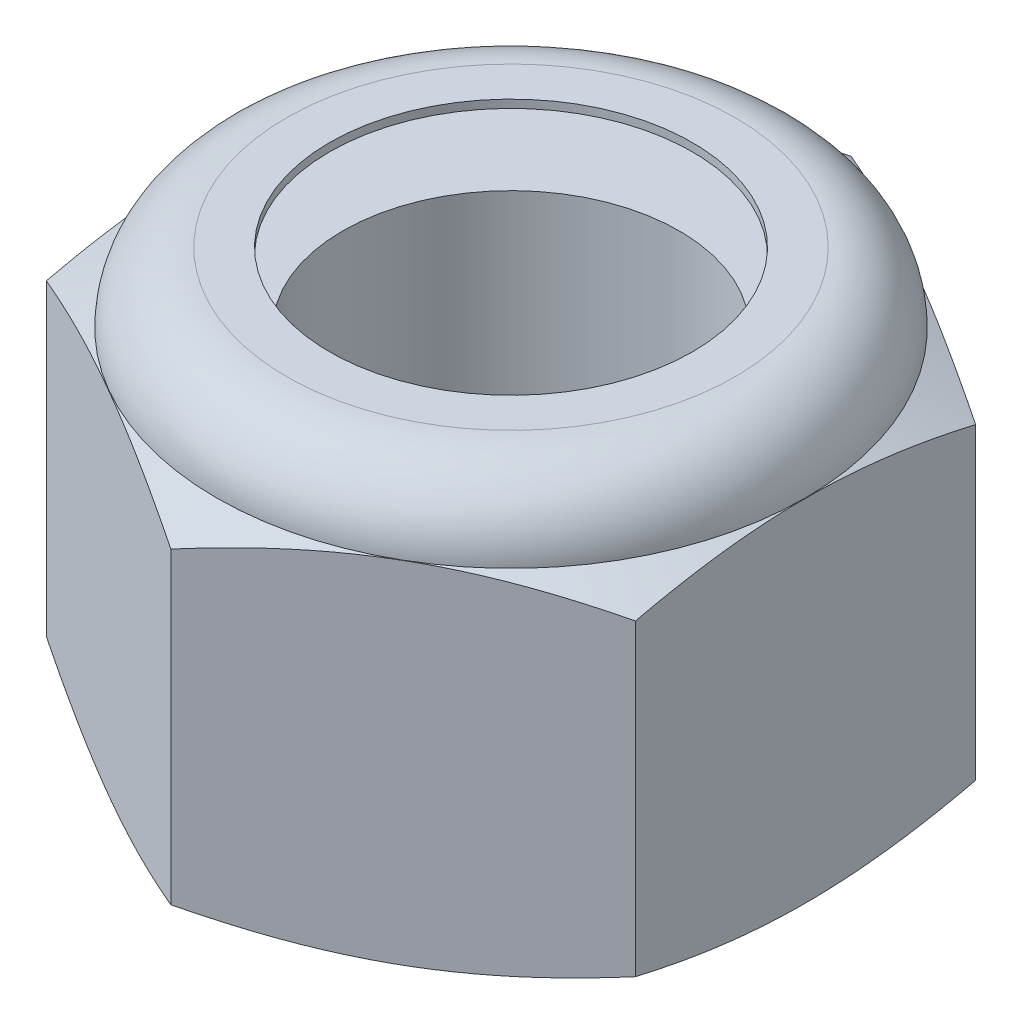
ISO-10303-21;
HEADER;
FILE_DESCRIPTION(('STEP AP214'),'2;1');
FILE_NAME('part.step','',(''),(''),'','','');
FILE_SCHEMA(('AUTOMOTIVE_DESIGN { 1 0 10303 214 1 1 1 1 }'));
ENDSEC;
DATA;
#1=APPLICATION_CONTEXT('core data for automotive mechanical design processes');
#2=APPLICATION_PROTOCOL_DEFINITION('international standard','automotive_design',2000,#1);
#3=PRODUCT_CONTEXT('',#1,'mechanical');
#4=PRODUCT('Part','Part','',(#3));
#5=PRODUCT_RELATED_PRODUCT_CATEGORY('part','',(#4));
#6=PRODUCT_DEFINITION_FORMATION('','',#4);
#7=PRODUCT_DEFINITION_CONTEXT('part definition',#1,'design');
#8=PRODUCT_DEFINITION('design','',#6,#7);
#9=PRODUCT_DEFINITION_SHAPE('','',#8);
#10=(LENGTH_UNIT() NAMED_UNIT(*) SI_UNIT(.MILLI.,.METRE.));
#11=(NAMED_UNIT(*) PLANE_ANGLE_UNIT() SI_UNIT($,.RADIAN.));
#12=(NAMED_UNIT(*) SI_UNIT($,.STERADIAN.) SOLID_ANGLE_UNIT());
#13=UNCERTAINTY_MEASURE_WITH_UNIT(LENGTH_MEASURE(1.E-05),#10,'distance_accuracy_value','');
#14=(GEOMETRIC_REPRESENTATION_CONTEXT(3) GLOBAL_UNCERTAINTY_ASSIGNED_CONTEXT((#13)) GLOBAL_UNIT_ASSIGNED_CONTEXT((#10,
#11,#12)) REPRESENTATION_CONTEXT('',''));
#15=CARTESIAN_POINT('',(0.,0.,0.));
#16=DIRECTION('',(0.,0.,1.));
#17=DIRECTION('',(1.,0.,0.));
#18=AXIS2_PLACEMENT_3D('',#15,#16,#17);
#19=CARTESIAN_POINT('',(2.77555756156289E-13,7.9375,-1.77635683940025E-12));
#20=DIRECTION('',(0.,1.,0.));
#21=DIRECTION('',(-1.,0.,0.));
#22=AXIS2_PLACEMENT_3D('',#19,#20,#21);
#23=PLANE('',#22);
#24=CARTESIAN_POINT('',(4.44337974886216E-13,7.93749999999992,0.));
#25=DIRECTION('',(0.,-1.,0.));
#26=DIRECTION('',(0.,0.,-1.));
#27=AXIS2_PLACEMENT_3D('',#24,#25,#26);
#28=CIRCLE('',#27,4.2314048663715);
#29=CARTESIAN_POINT('',(4.40013117424707E-13,7.93749999999992,-4.2314048663715));
#30=VERTEX_POINT('',#29);
#31=EDGE_CURVE('E264',#30,#30,#28,.T.);
#32=ORIENTED_EDGE('',*,*,#31,.F.);
#33=EDGE_LOOP('',(#32));
#34=FACE_BOUND('',#33,.T.);
#35=CARTESIAN_POINT('',(4.44337974886216E-13,7.9375,0.));
#36=DIRECTION('',(0.,-1.,0.));
#37=DIRECTION('',(1.,0.,0.));
#38=AXIS2_PLACEMENT_3D('',#35,#36,#37);
#39=CIRCLE('',#38,3.421620792);
#40=CARTESIAN_POINT('',(3.42162079200044,7.9375,0.));
#41=VERTEX_POINT('',#40);
#42=EDGE_CURVE('E273',#41,#41,#39,.T.);
#43=ORIENTED_EDGE('',*,*,#42,.T.);
#44=EDGE_LOOP('',(#43));
#45=FACE_BOUND('',#44,.T.);
#46=ADVANCED_FACE('F17',(#34,#45),#23,.T.);
#47=CARTESIAN_POINT('',(4.44089209850063E-13,6.61669999999992,0.));
#48=DIRECTION('',(0.,-1.,0.));
#49=DIRECTION('',(0.,0.,-1.));
#50=AXIS2_PLACEMENT_3D('',#47,#48,#49);
#51=TOROIDAL_SURFACE('',#50,4.23140486636972,1.3208);
#52=ORIENTED_EDGE('',*,*,#31,.T.);
#53=EDGE_LOOP('',(#52));
#54=FACE_BOUND('',#53,.T.);
#55=CARTESIAN_POINT('',(4.44089209850057E-13,6.61669999996661,0.));
#56=DIRECTION('',(0.,-1.,0.));
#57=DIRECTION('',(0.,0.,-1.));
#58=AXIS2_PLACEMENT_3D('',#55,#56,#57);
#59=CIRCLE('',#58,5.55220486637609);
#60=CARTESIAN_POINT('',(4.39774279873964E-13,6.61669999996661,-5.55220486637609));
#61=VERTEX_POINT('',#60);
#62=EDGE_CURVE('E275',#61,#61,#59,.T.);
#63=ORIENTED_EDGE('',*,*,#62,.F.);
#64=EDGE_LOOP('',(#63));
#65=FACE_BOUND('',#64,.T.);
#66=ADVANCED_FACE('F247',(#54,#65),#51,.T.);
#67=CARTESIAN_POINT('',(4.44089209850063E-13,6.61669999999992,0.));
#68=DIRECTION('',(0.,-1.,0.));
#69=DIRECTION('',(1.,0.,0.));
#70=AXIS2_PLACEMENT_3D('',#67,#68,#69);
#71=CYLINDRICAL_SURFACE('',#70,3.421620792);
#72=CARTESIAN_POINT('',(4.44309271228198E-13,7.7851,0.));
#73=DIRECTION('',(0.,-1.,0.));
#74=DIRECTION('',(1.,0.,0.));
#75=AXIS2_PLACEMENT_3D('',#72,#73,#74);
#76=CIRCLE('',#75,3.421620792);
#77=CARTESIAN_POINT('',(3.42162079200044,7.7851,0.));
#78=VERTEX_POINT('',#77);
#79=EDGE_CURVE('E81',#78,#78,#76,.T.);
#80=ORIENTED_EDGE('',*,*,#79,.T.);
#81=EDGE_LOOP('',(#80));
#82=FACE_BOUND('',#81,.T.);
#83=ORIENTED_EDGE('',*,*,#42,.F.);
#84=EDGE_LOOP('',(#83));
#85=FACE_BOUND('',#84,.T.);
#86=ADVANCED_FACE('F120',(#82,#85),#71,.F.);
#87=CARTESIAN_POINT('',(4.44012907934277E-13,6.21158048670623,0.));
#88=DIRECTION('',(0.,-1.,0.));
#89=DIRECTION('',(1.,0.,0.));
#90=AXIS2_PLACEMENT_3D('',#87,#88,#89);
#91=CONICAL_SURFACE('',#90,6.42098646619615,1.13446401379256);
#92=CARTESIAN_POINT('',(5.55625000000037,6.21399670638857,3.20790243317742));
#93=CARTESIAN_POINT('',(5.55625000000037,6.25923149858387,3.01388069204533));
#94=CARTESIAN_POINT('',(5.55625000000037,6.30156116960473,2.8191430562682));
#95=CARTESIAN_POINT('',(5.55625000000037,6.37940195851391,2.4282064821852));
#96=CARTESIAN_POINT('',(5.55625000000037,6.41490938776108,2.23200681260421));
#97=CARTESIAN_POINT('',(5.55625000000037,6.47807593658911,1.83814175454687));
#98=CARTESIAN_POINT('',(5.55625000000037,6.50572767728099,1.64047516580268));
#99=CARTESIAN_POINT('',(5.55625000000037,6.55216216918113,1.24412871221481));
#100=CARTESIAN_POINT('',(5.55625000000037,6.57094658201265,1.04544904426786));
#101=CARTESIAN_POINT('',(5.55625000000037,6.59860880741671,0.65153278954075));
#102=CARTESIAN_POINT('',(5.55625000000037,6.60768394067837,0.456310222188281));
#103=CARTESIAN_POINT('',(5.55625000000037,6.61623069714288,0.0656400290209491));
#104=CARTESIAN_POINT('',(5.55625000000037,6.61570174839892,-0.129807609504385));
#105=CARTESIAN_POINT('',(5.55625000000037,6.60506698548026,-0.520255424544184));
#106=CARTESIAN_POINT('',(5.55625000000037,6.59497009518901,-0.715255848303498));
#107=CARTESIAN_POINT('',(5.55625000000037,6.56563412978671,-1.10454411158436));
#108=CARTESIAN_POINT('',(5.55625000000037,6.5463958863742,-1.29883201431229));
#109=CARTESIAN_POINT('',(5.55625000000037,6.5055731461627,-1.63629474226344));
#110=CARTESIAN_POINT('',(5.55625000000037,6.48587969615706,-1.77970356548578));
#111=CARTESIAN_POINT('',(5.55625000000037,6.44224062386883,-2.06586571283912));
#112=CARTESIAN_POINT('',(5.55625000000038,6.41829517876256,-2.2086190640288));
#113=CARTESIAN_POINT('',(5.55625000000038,6.36633470846602,-2.49457300024797));
#114=CARTESIAN_POINT('',(5.55625000000038,6.33828827782006,-2.63776783527736));
#115=CARTESIAN_POINT('',(5.55625000000038,6.27867944477876,-2.92340048442409));
#116=CARTESIAN_POINT('',(5.55625000000038,6.24711763070223,-3.06583842104466));
#117=CARTESIAN_POINT('',(5.55625000000038,6.21399670638795,-3.2079024331801));
#118=B_SPLINE_CURVE_WITH_KNOTS('',3,(#92,#93,#94,#95,#96,#97,#98,#99,#100,#101,#102,#103,#104,
#105,#106,#107,#108,#109,#110,#111,#112,#113,#114,#115,#116,#117),.UNSPECIFIED.,.F.,.F.,(4,2,2,
2,2,2,2,2,2,2,2,2,4),(0.,0.597709107154746,1.19574047907784,1.79433174159176,2.39281079122883,
2.97888145915259,3.56498702914658,4.15054648426825,4.73605267422042,5.17025326679684,
5.60443577091931,6.04213667675271,6.47976444067784),.UNSPECIFIED.);
#119=CARTESIAN_POINT('',(5.55624999999998,6.21399670638805,3.20790243318035));
#120=VERTEX_POINT('',#119);
#121=CARTESIAN_POINT('',(5.55624999999768,6.21399670638777,-3.20790243318553));
#122=VERTEX_POINT('',#121);
#123=EDGE_CURVE('E69',#120,#122,#118,.T.);
#124=ORIENTED_EDGE('',*,*,#123,.T.);
#125=CARTESIAN_POINT('',(5.55624999999499,6.21399670638759,-3.20790243319096));
#126=CARTESIAN_POINT('',(5.38822224328807,6.25923149858288,-3.30491330375703));
#127=CARTESIAN_POINT('',(5.21957450363211,6.30156116960372,-3.40228212164562));
#128=CARTESIAN_POINT('',(4.88101349920769,6.37940195851289,-3.59775040868717));
#129=CARTESIAN_POINT('',(4.7110996011364,6.41490938776004,-3.69585024347769));
#130=CARTESIAN_POINT('',(4.37000245519562,6.47807593658804,-3.89278277250641));
#131=CARTESIAN_POINT('',(4.1988181678637,6.50572767727991,-3.99161606687852));
#132=CARTESIAN_POINT('',(3.85557207035666,6.55216216918002,-4.18978929367251));
#133=CARTESIAN_POINT('',(3.6835104306991,6.57094658201152,-4.289129127646));
#134=CARTESIAN_POINT('',(3.34236894714172,6.59860880741554,-4.48608725500961));
#135=CARTESIAN_POINT('',(3.17330124442243,6.60768394067719,-4.58369853868586));
#136=CARTESIAN_POINT('',(2.83497093263806,6.61623069714166,-4.77903363526958));
#137=CARTESIAN_POINT('',(2.6657083125654,6.61570174839768,-4.87675745453227));
#138=CARTESIAN_POINT('',(2.32757058588873,6.60506698547898,-5.07198136205221));
#139=CARTESIAN_POINT('',(2.15869526516439,6.59497009518772,-5.1694815739319));
#140=CARTESIAN_POINT('',(1.82156173976796,6.56563412978538,-5.36412570557237));
#141=CARTESIAN_POINT('',(1.65330348035753,6.54639588637286,-5.46126965693636));
#142=CARTESIAN_POINT('',(1.36105218512159,6.50557314616136,-5.63000102091185));
#143=CARTESIAN_POINT('',(1.2368565010844,6.48587969615575,-5.70170543252291));
#144=CARTESIAN_POINT('',(0.989032811875281,6.44224062386759,-5.84478650619936));
#145=CARTESIAN_POINT('',(0.865404783269841,6.41829517876136,-5.9161631817941));
#146=CARTESIAN_POINT('',(0.617761410192261,6.36633470846491,-6.05914014990347));
#147=CARTESIAN_POINT('',(0.493751045366281,6.338288277819,-6.13073756741805));
#148=CARTESIAN_POINT('',(0.246385915055344,6.27867944477782,-6.2735538919912));
#149=CARTESIAN_POINT('',(0.123031043479478,6.24711763070136,-6.34477286030137));
#150=CARTESIAN_POINT('',(6.82986573563673E-12,6.21399670638716,-6.41580486636899));
#151=B_SPLINE_CURVE_WITH_KNOTS('',3,(#125,#126,#127,#128,#129,#130,#131,#132,#133,#134,#135,
#136,#137,#138,#139,#140,#141,#142,#143,#144,#145,#146,#147,#148,#149,#150),.UNSPECIFIED.,.F.,
.F.,(4,2,2,2,2,2,2,2,2,2,2,2,4),(0.,0.597709107154881,1.19574047907811,1.79433174159216,
2.39281079122937,2.97888145915327,3.5649870291474,4.15054648426921,4.73605267422152,
5.17025326679729,5.6044357709191,6.04213667675182,6.47976444067628),.UNSPECIFIED.);
#152=CARTESIAN_POINT('',(-2.32951908489674E-12,6.21399670638639,-6.41580486637061));
#153=VERTEX_POINT('',#152);
#154=EDGE_CURVE('E127',#122,#153,#151,.T.);
#155=ORIENTED_EDGE('',*,*,#154,.T.);
#156=CARTESIAN_POINT('',(-5.46835667690095E-12,6.21399670638726,-6.41580486636876));
#157=CARTESIAN_POINT('',(-0.168027756712424,6.25923149858257,-6.31879399580267));
#158=CARTESIAN_POINT('',(-0.33667549636842,6.30156116960346,-6.22142517791406));
#159=CARTESIAN_POINT('',(-0.675236500792909,6.37940195851269,-6.02595689087247));
#160=CARTESIAN_POINT('',(-0.845150398864238,6.41490938775989,-5.92785705608193));
#161=CARTESIAN_POINT('',(-1.18624754480509,6.47807593658796,-5.73092452705317));
#162=CARTESIAN_POINT('',(-1.35743183213705,6.50572767727986,-5.63209123268103));
#163=CARTESIAN_POINT('',(-1.70067792964417,6.55216216918004,-5.433918005887));
#164=CARTESIAN_POINT('',(-1.87273956930177,6.57094658201157,-5.33457817191348));
#165=CARTESIAN_POINT('',(-2.21388105285922,6.59860880741566,-5.13762004454983));
#166=CARTESIAN_POINT('',(-2.38294875557856,6.60768394067733,-5.04000876087355));
#167=CARTESIAN_POINT('',(-2.721279067363,6.61623069714186,-4.84467366428979));
#168=CARTESIAN_POINT('',(-2.8905416874357,6.6157017483979,-4.74694984502708));
#169=CARTESIAN_POINT('',(-3.22867941411246,6.60506698547924,-4.55172593750708));
#170=CARTESIAN_POINT('',(-3.39755473483683,6.594970095188,-4.45422572562738));
#171=CARTESIAN_POINT('',(-3.73468826023335,6.56563412978569,-4.25958159398685));
#172=CARTESIAN_POINT('',(-3.90294651964381,6.54639588637318,-4.16243764262284));
#173=CARTESIAN_POINT('',(-4.19519781487964,6.50557314616172,-3.99370627864742));
#174=CARTESIAN_POINT('',(-4.31939349891669,6.48587969615615,-3.92200186703644));
#175=CARTESIAN_POINT('',(-4.56721718812551,6.44224062386807,-3.77892079336016));
#176=CARTESIAN_POINT('',(-4.6908452167308,6.41829517876189,-3.70754411776552));
#177=CARTESIAN_POINT('',(-4.93848858980808,6.36633470846554,-3.56456714965632));
#178=CARTESIAN_POINT('',(-5.06249895463391,6.33828827781969,-3.49296973214182));
#179=CARTESIAN_POINT('',(-5.30986408494454,6.27867944477862,-3.35015340756885));
#180=CARTESIAN_POINT('',(-5.43321895652026,6.24711763070222,-3.27893443925876));
#181=CARTESIAN_POINT('',(-5.55624999999276,6.21399670638808,-3.20790243319123));
#182=B_SPLINE_CURVE_WITH_KNOTS('',3,(#156,#157,#158,#159,#160,#161,#162,#163,#164,#165,#166,
#167,#168,#169,#170,#171,#172,#173,#174,#175,#176,#177,#178,#179,#180,#181),.UNSPECIFIED.,.F.,
.F.,(4,2,2,2,2,2,2,2,2,2,2,2,4),(0.,0.597709107155025,1.1957404790784,1.7943317415926,
2.39281079122995,2.97888145915399,3.56498702914826,4.15054648427021,4.73605267422265,
5.17025326679789,5.60443577091917,6.04213667675134,6.47976444067527),.UNSPECIFIED.);
#183=CARTESIAN_POINT('',(-5.5562499999985,6.21399670638738,-3.20790243318428));
#184=VERTEX_POINT('',#183);
#185=EDGE_CURVE('E136',#153,#184,#182,.T.);
#186=ORIENTED_EDGE('',*,*,#185,.T.);
#187=CARTESIAN_POINT('',(-5.55624999999837,6.21399670638826,-3.20790243318072));
#188=CARTESIAN_POINT('',(-5.55624999999837,6.2592314985836,-3.01388069204858));
#189=CARTESIAN_POINT('',(-5.55624999999837,6.30156116960452,-2.81914305627139));
#190=CARTESIAN_POINT('',(-5.55624999999837,6.37940195851381,-2.42820648218829));
#191=CARTESIAN_POINT('',(-5.55624999999837,6.41490938776103,-2.23200681260724));
#192=CARTESIAN_POINT('',(-5.55624999999837,6.47807593658918,-1.83814175454979));
#193=CARTESIAN_POINT('',(-5.55624999999837,6.50572767728111,-1.64047516580554));
#194=CARTESIAN_POINT('',(-5.55624999999837,6.55216216918136,-1.24412871221755));
#195=CARTESIAN_POINT('',(-5.55624999999837,6.57094658201293,-1.04544904427055));
#196=CARTESIAN_POINT('',(-5.55624999999837,6.59860880741709,-0.651532789543319));
#197=CARTESIAN_POINT('',(-5.55624999999837,6.6076839406788,-0.456310222190793));
#198=CARTESIAN_POINT('',(-5.55624999999837,6.61623069714339,-0.065640029023343));
#199=CARTESIAN_POINT('',(-5.55624999999837,6.61570174839947,0.129807609502051));
#200=CARTESIAN_POINT('',(-5.55624999999837,6.60506698548087,0.520255424541971));
#201=CARTESIAN_POINT('',(-5.55624999999837,6.59497009518966,0.715255848301346));
#202=CARTESIAN_POINT('',(-5.55624999999837,6.56563412978741,1.10454411158233));
#203=CARTESIAN_POINT('',(-5.55624999999837,6.54639588637492,1.29883201431032));
#204=CARTESIAN_POINT('',(-5.55624999999837,6.50557314616348,1.63629474226129));
#205=CARTESIAN_POINT('',(-5.55624999999837,6.4858796961579,1.77970356548339));
#206=CARTESIAN_POINT('',(-5.55624999999837,6.44224062386979,2.06586571283624));
#207=CARTESIAN_POINT('',(-5.55624999999837,6.41829517876358,2.20861906402568));
#208=CARTESIAN_POINT('',(-5.55624999999837,6.36633470846718,2.49457300024437));
#209=CARTESIAN_POINT('',(-5.55624999999837,6.3382882778213,2.63776783527351));
#210=CARTESIAN_POINT('',(-5.55624999999837,6.27867944478016,2.92340048441976));
#211=CARTESIAN_POINT('',(-5.55624999999837,6.24711763070371,3.06583842104009));
#212=CARTESIAN_POINT('',(-5.55624999999837,6.21399670638953,3.20790243317529));
#213=B_SPLINE_CURVE_WITH_KNOTS('',3,(#187,#188,#189,#190,#191,#192,#193,#194,#195,#196,#197,
#198,#199,#200,#201,#202,#203,#204,#205,#206,#207,#208,#209,#210,#211,#212),.UNSPECIFIED.,.F.,
.F.,(4,2,2,2,2,2,2,2,2,2,2,2,4),(0.,0.597709107154934,1.19574047907822,1.79433174159233,
2.3928107912296,2.97888145915354,3.5649870291477,4.15054648426955,4.73605267422189,
5.17025326679757,5.6044357709193,6.04213667675194,6.47976444067632),.UNSPECIFIED.);
#214=CARTESIAN_POINT('',(-5.55624999999562,6.21399670638873,3.20790243318347));
#215=VERTEX_POINT('',#214);
#216=EDGE_CURVE('E142',#184,#215,#213,.T.);
#217=ORIENTED_EDGE('',*,*,#216,.T.);
#218=CARTESIAN_POINT('',(-5.55624999999286,6.21399670638948,3.20790243318501));
#219=CARTESIAN_POINT('',(-5.38822224328601,6.2592314985848,3.30491330375104));
#220=CARTESIAN_POINT('',(-5.21957450363012,6.30156116960569,3.40228212163959));
#221=CARTESIAN_POINT('',(-4.88101349920584,6.37940195851494,3.59775040868106));
#222=CARTESIAN_POINT('',(-4.71109960113462,6.41490938776214,3.69585024347154));
#223=CARTESIAN_POINT('',(-4.37000245519398,6.47807593659024,3.89278277250018));
#224=CARTESIAN_POINT('',(-4.19881816786212,6.50572767728215,3.99161606687226));
#225=CARTESIAN_POINT('',(-3.8555720703552,6.55216216918237,4.18978929366617));
#226=CARTESIAN_POINT('',(-3.68351043069771,6.57094658201392,4.28912912763963));
#227=CARTESIAN_POINT('',(-3.34236894714046,6.59860880741806,4.48608725500316));
#228=CARTESIAN_POINT('',(-3.17330124442123,6.60768394067976,4.58369853867938));
#229=CARTESIAN_POINT('',(-2.83497093263699,6.61623069714434,4.77903363526302));
#230=CARTESIAN_POINT('',(-2.6657083125644,6.61570174840041,4.87675745452568));
#231=CARTESIAN_POINT('',(-2.32757058588785,6.60506698548181,5.07198136204555));
#232=CARTESIAN_POINT('',(-2.15869526516357,6.59497009519059,5.16948157392519));
#233=CARTESIAN_POINT('',(-1.82156173976727,6.56563412978834,5.3641257055656));
#234=CARTESIAN_POINT('',(-1.6533034803569,6.54639588637586,5.46126965692955));
#235=CARTESIAN_POINT('',(-1.36105218512084,6.5055731461644,5.63000102090511));
#236=CARTESIAN_POINT('',(-1.23685650108346,6.48587969615878,5.70170543251628));
#237=CARTESIAN_POINT('',(-0.989032811873983,6.44224062387058,5.84478650619294));
#238=CARTESIAN_POINT('',(-0.865404783268364,6.41829517876432,5.91616318178778));
#239=CARTESIAN_POINT('',(-0.617761410190423,6.36633470846779,6.05914014989735));
#240=CARTESIAN_POINT('',(-0.493751045364262,6.33828827782184,6.13073756741204));
#241=CARTESIAN_POINT('',(-0.246385915052965,6.27867944478055,6.2735538919854));
#242=CARTESIAN_POINT('',(-0.123031043476921,6.24711763070403,6.34477286029568));
#243=CARTESIAN_POINT('',(-4.09494177407682E-12,6.21399670638977,6.41580486636339));
#244=B_SPLINE_CURVE_WITH_KNOTS('',3,(#218,#219,#220,#221,#222,#223,#224,#225,#226,#227,#228,
#229,#230,#231,#232,#233,#234,#235,#236,#237,#238,#239,#240,#241,#242,#243),.UNSPECIFIED.,.F.,
.F.,(4,2,2,2,2,2,2,2,2,2,2,2,4),(0.,0.597709107154671,1.1957404790777,1.79433174159154,
2.39281079122855,2.97888145915223,3.56498702914614,4.15054648426773,4.73605267421981,
5.1702532667962,5.60443577091864,6.04213667675201,6.47976444067711),.UNSPECIFIED.);
#245=CARTESIAN_POINT('',(4.29679002410486E-12,6.21399670638887,6.41580486636531));
#246=VERTEX_POINT('',#245);
#247=EDGE_CURVE('E88',#215,#246,#244,.T.);
#248=ORIENTED_EDGE('',*,*,#247,.T.);
#249=CARTESIAN_POINT('',(6.92903899279192E-12,6.21399670638952,6.4158048663639));
#250=CARTESIAN_POINT('',(0.168027756713754,6.2592314985848,6.31879399579789));
#251=CARTESIAN_POINT('',(0.336675496369618,6.30156116960564,6.22142517790935));
#252=CARTESIAN_POINT('',(0.675236500793843,6.3794019585148,6.02595689086792));
#253=CARTESIAN_POINT('',(0.845150398865038,6.41490938776196,5.92785705607745));
#254=CARTESIAN_POINT('',(1.18624754480562,6.47807593658997,5.73092452704884));
#255=CARTESIAN_POINT('',(1.35743183213745,6.50572767728184,5.63209123267678));
#256=CARTESIAN_POINT('',(1.7006779296443,6.55216216918196,5.43391800588291));
#257=CARTESIAN_POINT('',(1.87273956930176,6.57094658201347,5.33457817190946));
#258=CARTESIAN_POINT('',(2.21388105285895,6.59860880741752,5.13762004454597));
#259=CARTESIAN_POINT('',(2.38294875557815,6.60768394067918,5.04000876086977));
#260=CARTESIAN_POINT('',(2.72127906736233,6.61623069714369,4.84467366428617));
#261=CARTESIAN_POINT('',(2.89054168743489,6.61570174839972,4.74694984502353));
#262=CARTESIAN_POINT('',(3.22867941411138,6.60506698548106,4.55172593750369));
#263=CARTESIAN_POINT('',(3.39755473483562,6.59497009518982,4.45422572562407));
#264=CARTESIAN_POINT('',(3.73468826023186,6.56563412978752,4.2595815939837));
#265=CARTESIAN_POINT('',(3.9029465196422,6.54639588637502,4.16243764261976));
#266=CARTESIAN_POINT('',(4.19519781487812,6.50557314616354,3.99370627864428));
#267=CARTESIAN_POINT('',(4.31939349891539,6.48587969615792,3.92200186703318));
#268=CARTESIAN_POINT('',(4.56721718812467,6.44224062386974,3.77892079335663));
#269=CARTESIAN_POINT('',(4.69084521673018,6.41829517876349,3.70754411776186));
#270=CARTESIAN_POINT('',(4.93848858980792,6.366334708467,3.5645671496524));
#271=CARTESIAN_POINT('',(5.06249895463398,6.33828827782107,3.49296973213777));
#272=CARTESIAN_POINT('',(5.30986408494507,6.27867944477984,3.35015340756454));
#273=CARTESIAN_POINT('',(5.43321895652101,6.24711763070334,3.27893443925431));
#274=CARTESIAN_POINT('',(5.55624999999373,6.21399670638911,3.20790243318666));
#275=B_SPLINE_CURVE_WITH_KNOTS('',3,(#249,#250,#251,#252,#253,#254,#255,#256,#257,#258,#259,
#260,#261,#262,#263,#264,#265,#266,#267,#268,#269,#270,#271,#272,#273,#274),.UNSPECIFIED.,.F.,
.F.,(4,2,2,2,2,2,2,2,2,2,2,2,4),(0.,0.597709107154554,1.19574047907746,1.79433174159118,
2.39281079122807,2.97888145915164,3.56498702914544,4.15054648426692,4.7360526742189,
5.17025326679494,5.60443577091702,6.04213667675002,6.47976444067476),.UNSPECIFIED.);
#276=EDGE_CURVE('E80',#246,#120,#275,.T.);
#277=ORIENTED_EDGE('',*,*,#276,.T.);
#278=EDGE_LOOP('',(#124,#155,#186,#217,#248,#277));
#279=FACE_BOUND('',#278,.T.);
#280=ORIENTED_EDGE('',*,*,#62,.T.);
#281=EDGE_LOOP('',(#280));
#282=FACE_BOUND('',#281,.T.);
#283=ADVANCED_FACE('F91',(#279,#282),#91,.T.);
#284=CARTESIAN_POINT('',(1.60982338570648E-12,7.7851,-3.42162079200192));
#285=DIRECTION('',(0.,1.,0.));
#286=DIRECTION('',(-1.,0.,0.));
#287=AXIS2_PLACEMENT_3D('',#284,#285,#286);
#288=PLANE('',#287);
#289=CARTESIAN_POINT('',(4.44309271228198E-13,7.78509999999992,0.));
#290=DIRECTION('',(0.,1.,0.));
#291=DIRECTION('',(0.,0.,-1.));
#292=AXIS2_PLACEMENT_3D('',#289,#290,#291);
#293=CIRCLE('',#292,4.2314048663715);
#294=CARTESIAN_POINT('',(4.41020809051789E-13,7.78509999999992,-4.2314048663715));
#295=VERTEX_POINT('',#294);
#296=EDGE_CURVE('E292',#295,#295,#293,.F.);
#297=ORIENTED_EDGE('',*,*,#296,.T.);
#298=EDGE_LOOP('',(#297));
#299=FACE_BOUND('',#298,.T.);
#300=ORIENTED_EDGE('',*,*,#79,.F.);
#301=EDGE_LOOP('',(#300));
#302=FACE_BOUND('',#301,.T.);
#303=ADVANCED_FACE('F119',(#299,#302),#288,.F.);
#304=CARTESIAN_POINT('',(5.55625000000037,7.9375,3.20790243318414));
#305=DIRECTION('',(-1.,0.,0.));
#306=DIRECTION('',(0.,0.,1.));
#307=AXIS2_PLACEMENT_3D('',#304,#305,#306);
#308=PLANE('',#307);
#309=ORIENTED_EDGE('',*,*,#123,.F.);
#310=DIRECTION('',(0.,1.,0.));
#311=VECTOR('',#310,1.);
#312=CARTESIAN_POINT('',(5.5562499999996,7.9375,3.20790243318327));
#313=LINE('',#312,#311);
#314=CARTESIAN_POINT('',(5.55624999999999,0.402703281160659,3.20790237977256));
#315=VERTEX_POINT('',#314);
#316=EDGE_CURVE('E73',#120,#315,#313,.F.);
#317=ORIENTED_EDGE('',*,*,#316,.T.);
#318=CARTESIAN_POINT('',(5.55625000000038,0.40270326870639,-3.20790232635536));
#319=CARTESIAN_POINT('',(5.55625000000038,0.357468478219363,-3.01388058771791));
#320=CARTESIAN_POINT('',(5.55625000000038,0.315138808917627,-2.81914295445101));
#321=CARTESIAN_POINT('',(5.55625000000038,0.237298023427693,-2.42820638544056));
#322=CARTESIAN_POINT('',(5.55625000000038,0.201790595880478,-2.23200671842193));
#323=CARTESIAN_POINT('',(5.55625000000038,0.138624050396129,-1.83814166559089));
#324=CARTESIAN_POINT('',(5.55625000000038,0.110972311346399,-1.64047507951093));
#325=CARTESIAN_POINT('',(5.55625000000038,0.0645378225998266,-1.24412863132257));
#326=CARTESIAN_POINT('',(5.55625000000038,0.0457534112798194,-1.04544896611086));
#327=CARTESIAN_POINT('',(5.55625000000038,0.0180911886569813,-0.651532716706454));
#328=CARTESIAN_POINT('',(5.55625000000037,0.00901605667693185,-0.456310151939371));
#329=CARTESIAN_POINT('',(5.55625000000037,0.000469302536817742,-0.0656399640029298));
#330=CARTESIAN_POINT('',(5.55625000000037,0.000998252323565082,0.129807671876895));
#331=CARTESIAN_POINT('',(5.55625000000037,0.0116330170439723,0.520255481601839));
#332=CARTESIAN_POINT('',(5.55625000000037,0.0217299080951417,0.715255902691824));
#333=CARTESIAN_POINT('',(5.55625000000037,0.0510658747180078,1.10454416061868));
#334=CARTESIAN_POINT('',(5.55625000000037,0.0703041185911593,1.29883206066194));
#335=CARTESIAN_POINT('',(5.55625000000037,0.111126858062196,1.63629477327942));
#336=CARTESIAN_POINT('',(5.55625000000037,0.1308203065891,1.77970358389388));
#337=CARTESIAN_POINT('',(5.55625000000037,0.174459375167784,2.06586570614021));
#338=CARTESIAN_POINT('',(5.55625000000037,0.198404818043104,2.20861904483078));
#339=CARTESIAN_POINT('',(5.55625000000037,0.250365283185666,2.49457295594553));
#340=CARTESIAN_POINT('',(5.55625000000037,0.2784117108997,2.6377677783713));
#341=CARTESIAN_POINT('',(5.55625000000037,0.338020537520473,2.92340040245643));
#342=CARTESIAN_POINT('',(5.55625000000037,0.369582348108804,3.06583832661893));
#343=CARTESIAN_POINT('',(5.55625000000037,0.402703268707898,3.20790232636186));
#344=B_SPLINE_CURVE_WITH_KNOTS('',3,(#318,#319,#320,#321,#322,#323,#324,#325,#326,#327,#328,
#329,#330,#331,#332,#333,#334,#335,#336,#337,#338,#339,#340,#341,#342,#343),.UNSPECIFIED.,.F.,
.F.,(4,2,2,2,2,2,2,2,2,2,2,2,4),(0.,0.597709098700487,1.19574046215064,1.7943317160683,
2.39281075711416,2.97888141711877,3.56498697919452,4.15054642644821,4.73605260853127,
5.17025316305109,5.60443562910095,6.04213649614878,6.47976422133334),.UNSPECIFIED.);
#345=CARTESIAN_POINT('',(5.55625003316748,0.402703302544137,-3.20790241403881));
#346=VERTEX_POINT('',#345);
#347=EDGE_CURVE('E296',#346,#315,#344,.T.);
#348=ORIENTED_EDGE('',*,*,#347,.F.);
#349=DIRECTION('',(0.,1.,0.));
#350=VECTOR('',#349,1.);
#351=CARTESIAN_POINT('',(5.55625000000161,7.9375,-3.20790243318713));
#352=LINE('',#351,#350);
#353=EDGE_CURVE('E75',#346,#122,#352,.T.);
#354=ORIENTED_EDGE('',*,*,#353,.T.);
#355=EDGE_LOOP('',(#309,#317,#348,#354));
#356=FACE_BOUND('',#355,.T.);
#357=ADVANCED_FACE('F71',(#356),#308,.F.);
#358=CARTESIAN_POINT('',(8.88178419700125E-13,7.9375,6.41580486636739));
#359=DIRECTION('',(-0.500000000000001,0.,-0.866025403784438));
#360=DIRECTION('',(-0.866025403784438,0.,0.500000000000001));
#361=AXIS2_PLACEMENT_3D('',#358,#359,#360);
#362=PLANE('',#361);
#363=ORIENTED_EDGE('',*,*,#276,.F.);
#364=DIRECTION('',(0.,1.,0.));
#365=VECTOR('',#364,1.);
#366=CARTESIAN_POINT('',(1.66446717519975E-12,7.9375,6.41580486636672));
#367=LINE('',#366,#365);
#368=CARTESIAN_POINT('',(4.62599104260528E-08,0.402703281158823,6.41580483965962));
#369=VERTEX_POINT('',#368);
#370=EDGE_CURVE('E149',#246,#369,#367,.F.);
#371=ORIENTED_EDGE('',*,*,#370,.T.);
#372=CARTESIAN_POINT('',(5.55625004147268,0.402703337505694,3.20790236393589));
#373=CARTESIAN_POINT('',(5.38822229955392,0.357468527516491,3.30491325499334));
#374=CARTESIAN_POINT('',(5.21957456541832,0.315138848544429,3.40228208160661));
#375=CARTESIAN_POINT('',(4.88101356397116,0.237298052429358,3.59775037565498));
#376=CARTESIAN_POINT('',(4.71109966335324,0.201790623927034,3.69585020872154));
#377=CARTESIAN_POINT('',(4.37000251461933,0.138624074245998,3.89278273702221));
#378=CARTESIAN_POINT('',(4.19881822704383,0.110972331947608,3.99161603239234));
#379=CARTESIAN_POINT('',(3.85557212836764,0.0645378374394495,4.18978926048825));
#380=CARTESIAN_POINT('',(3.68351048778435,0.0457534236091621,4.28912909476596));
#381=CARTESIAN_POINT('',(3.34236900274618,0.018091196113558,4.48608722281989));
#382=CARTESIAN_POINT('',(3.17330129947033,0.00901606174879935,4.5836985068771));
#383=CARTESIAN_POINT('',(2.83497098651809,0.000469303174432906,4.77903360417872));
#384=CARTESIAN_POINT('',(2.66570836583415,0.000998250909842347,4.87675742377836));
#385=CARTESIAN_POINT('',(2.32757063785496,0.0116330118944489,5.07198133203864));
#386=CARTESIAN_POINT('',(2.15869531643949,0.0217299012630097,5.16948154432163));
#387=CARTESIAN_POINT('',(1.82156178961788,0.0510658649545855,5.36412567678803));
#388=CARTESIAN_POINT('',(1.65330352947344,0.0703041075796216,5.46126962857461));
#389=CARTESIAN_POINT('',(1.36105223724978,0.111126845945796,5.63000099081033));
#390=CARTESIAN_POINT('',(1.23685655694469,0.130820294700973,5.70170540026686));
#391=CARTESIAN_POINT('',(0.98903287516776,0.174459364286615,5.84478646965248));
#392=CARTESIAN_POINT('',(0.865404850262344,0.198404807940324,5.91616314311095));
#393=CARTESIAN_POINT('',(0.617761484553477,0.250365275161586,6.05914010696595));
#394=CARTESIAN_POINT('',(0.493751123395916,0.278411704184062,6.13073752236258));
#395=CARTESIAN_POINT('',(0.246386000363804,0.338020533854487,6.27355384273332));
#396=CARTESIAN_POINT('',(0.123031132398436,0.369582346184132,6.34477280895898));
#397=CARTESIAN_POINT('',(9.25181552603001E-08,0.402703268705093,6.41580481295252));
#398=B_SPLINE_CURVE_WITH_KNOTS('',3,(#372,#373,#374,#375,#376,#377,#378,#379,#380,#381,#382,
#383,#384,#385,#386,#387,#388,#389,#390,#391,#392,#393,#394,#395,#396,#397),.UNSPECIFIED.,.F.,
.F.,(4,2,2,2,2,2,2,2,2,2,2,2,4),(0.,0.597709110979283,1.19574048627961,1.79433175168533,
2.39281080440531,2.97888147451503,3.56498704658574,4.15054650395938,4.73605269620025,
5.17025327546298,5.60443576622664,6.04213665865459,6.47976440923702),.UNSPECIFIED.);
#399=EDGE_CURVE('E87',#315,#369,#398,.T.);
#400=ORIENTED_EDGE('',*,*,#399,.F.);
#401=ORIENTED_EDGE('',*,*,#316,.F.);
#402=EDGE_LOOP('',(#363,#371,#400,#401));
#403=FACE_BOUND('',#402,.T.);
#404=ADVANCED_FACE('F84',(#403),#362,.F.);
#405=CARTESIAN_POINT('',(-5.5562499999986,7.9375,3.2079024331817));
#406=DIRECTION('',(0.500000000000001,0.,-0.866025403784438));
#407=DIRECTION('',(-0.866025403784438,0.,-0.500000000000001));
#408=AXIS2_PLACEMENT_3D('',#405,#406,#407);
#409=PLANE('',#408);
#410=ORIENTED_EDGE('',*,*,#247,.F.);
#411=DIRECTION('',(0.,1.,0.));
#412=VECTOR('',#411,1.);
#413=CARTESIAN_POINT('',(-5.55624999999837,7.9375,3.20790243318192));
#414=LINE('',#413,#412);
#415=CARTESIAN_POINT('',(-5.55624995375358,0.402703281162439,3.20790245988132));
#416=VERTEX_POINT('',#415);
#417=EDGE_CURVE('E148',#215,#416,#414,.F.);
#418=ORIENTED_EDGE('',*,*,#417,.T.);
#419=CARTESIAN_POINT('',(8.0716357707804E-08,0.402703337508343,6.41580486766179));
#420=CARTESIAN_POINT('',(-0.16802768634319,0.357468527518024,6.31879402014968));
#421=CARTESIAN_POINT('',(-0.336675430795093,0.315138848545431,6.22142521140472));
#422=CARTESIAN_POINT('',(-0.675236439799319,0.237298052429813,6.02595693044528));
#423=CARTESIAN_POINT('',(-0.845150337650959,0.201790623927474,5.92785709258712));
#424=CARTESIAN_POINT('',(-1.18624748435793,0.138624074246267,5.73092456077524));
#425=CARTESIAN_POINT('',(-1.35743177267605,0.110972331947722,5.63209126669118));
#426=CARTESIAN_POINT('',(-1.70067787189536,0.0645378374392923,5.43391803953558));
#427=CARTESIAN_POINT('',(-1.87273951227933,0.0457534236088895,5.3345782049124));
#428=CARTESIAN_POINT('',(-2.2138809971751,0.0180911961130566,5.13762007661146));
#429=CARTESIAN_POINT('',(-2.38294870050265,0.00901606174818292,5.04000879264365));
#430=CARTESIAN_POINT('',(-2.72127901349282,0.000469303173599026,4.84467369540742));
#431=CARTESIAN_POINT('',(-2.89054163416299,0.000998250908905916,4.74694987578377));
#432=CARTESIAN_POINT('',(-3.22867936213221,0.0116330118933195,4.55172596750589));
#433=CARTESIAN_POINT('',(-3.39755468355147,0.0217299012617902,4.45422575522929));
#434=CARTESIAN_POINT('',(-3.73468821037592,0.0510658649532027,4.25958162276744));
#435=CARTESIAN_POINT('',(-3.9029464705194,0.0703041075781658,4.16243767097903));
#436=CARTESIAN_POINT('',(-4.19519776274549,0.111126845944624,3.99370630874066));
#437=CARTESIAN_POINT('',(-4.31939344305363,0.130820294700259,3.92200189928276));
#438=CARTESIAN_POINT('',(-4.56721712483641,0.17445936428701,3.77892082989405));
#439=CARTESIAN_POINT('',(-4.69084514974463,0.19840480794137,3.70754415643386));
#440=CARTESIAN_POINT('',(-4.93848851545919,0.250365275164113,3.56456719257549));
#441=CARTESIAN_POINT('',(-5.06249887661963,0.278411704187421,3.49296977717722));
#442=CARTESIAN_POINT('',(-5.30986399965748,0.338020533859654,3.35015345680321));
#443=CARTESIAN_POINT('',(-5.43321886762569,0.369582346190274,3.27893449057592));
#444=CARTESIAN_POINT('',(-5.55624990750878,0.402703268712268,3.20790248658072));
#445=B_SPLINE_CURVE_WITH_KNOTS('',3,(#419,#420,#421,#422,#423,#424,#425,#426,#427,#428,#429,
#430,#431,#432,#433,#434,#435,#436,#437,#438,#439,#440,#441,#442,#443,#444),.UNSPECIFIED.,.F.,
.F.,(4,2,2,2,2,2,2,2,2,2,2,2,4),(0.,0.597709110979687,1.19574048628039,1.79433175168646,
2.3928108044068,2.97888147451676,3.56498704658771,4.15054650396159,4.73605269620272,
5.17025327547551,5.60443576624922,6.04213665868742,6.47976440928009),.UNSPECIFIED.);
#446=EDGE_CURVE('E168',#369,#416,#445,.T.);
#447=ORIENTED_EDGE('',*,*,#446,.F.);
#448=ORIENTED_EDGE('',*,*,#370,.F.);
#449=EDGE_LOOP('',(#410,#418,#447,#448));
#450=FACE_BOUND('',#449,.T.);
#451=ADVANCED_FACE('F154',(#450),#409,.F.);
#452=CARTESIAN_POINT('',(-5.55624999999837,7.9375,-3.20790243318814));
#453=DIRECTION('',(1.,0.,0.));
#454=DIRECTION('',(0.,0.,-1.));
#455=AXIS2_PLACEMENT_3D('',#452,#453,#454);
#456=PLANE('',#455);
#457=ORIENTED_EDGE('',*,*,#216,.F.);
#458=DIRECTION('',(0.,1.,0.));
#459=VECTOR('',#458,1.);
#460=CARTESIAN_POINT('',(-5.55624999999862,7.9375,-3.20790243318785));
#461=LINE('',#460,#459);
#462=CARTESIAN_POINT('',(-5.55624999999849,0.402703281161343,-3.20790237977807));
#463=VERTEX_POINT('',#462);
#464=EDGE_CURVE('E318',#184,#463,#461,.F.);
#465=ORIENTED_EDGE('',*,*,#464,.T.);
#466=CARTESIAN_POINT('',(-5.55624996077561,0.40270333749624,3.20790250371734));
#467=CARTESIAN_POINT('',(-5.5562499859089,0.357468527511712,3.01388076514549));
#468=CARTESIAN_POINT('',(-5.55624999622206,0.315138848541643,2.81914312978637));
#469=CARTESIAN_POINT('',(-5.55625000377672,0.23729805242819,2.428206554778));
#470=CARTESIAN_POINT('',(-5.55625000101116,0.201790623925492,2.23200688385361));
#471=CARTESIAN_POINT('',(-5.55624999898464,0.138624074244348,1.83814182374131));
#472=CARTESIAN_POINT('',(-5.55624999972696,0.11097233194623,1.64047523428706));
#473=CARTESIAN_POINT('',(-5.55625000026974,0.0645378374384607,1.24412877903554));
#474=CARTESIAN_POINT('',(-5.55625000007038,0.0457534236082915,1.04544911013471));
#475=CARTESIAN_POINT('',(-5.55624999992786,0.0180911961129728,0.651532853779848));
#476=CARTESIAN_POINT('',(-5.55624999997948,0.00901606174838311,0.456310285754786));
#477=CARTESIAN_POINT('',(-5.55625000001727,0.000469303174353242,0.0656400912168376));
#478=CARTESIAN_POINT('',(-5.55625000000343,0.000998250909930728,-0.129807548006485));
#479=CARTESIAN_POINT('',(-5.55624999999332,0.0116330118948799,-0.520255364544689));
#480=CARTESIAN_POINT('',(-5.55624999999703,0.0217299012636145,-0.7152557891043));
#481=CARTESIAN_POINT('',(-5.55624999999971,0.0510658649555314,-1.10454405403256));
#482=CARTESIAN_POINT('',(-5.55624999999868,0.0703041075807348,-1.29883195760754));
#483=CARTESIAN_POINT('',(-5.55624999999814,0.111126845947235,-1.63629468208034));
#484=CARTESIAN_POINT('',(-5.55624999999831,0.130820294702582,-1.77970350099347));
#485=CARTESIAN_POINT('',(-5.55624999999843,0.174459364288579,-2.06586563976525));
#486=CARTESIAN_POINT('',(-5.55624999999839,0.198404807942471,-2.20861898668264));
#487=CARTESIAN_POINT('',(-5.55624999999835,0.25036527516411,-2.49457291439343));
#488=CARTESIAN_POINT('',(-5.55624999999836,0.278411704186778,-2.63776774518703));
#489=CARTESIAN_POINT('',(-5.55624999999838,0.338020533857592,-2.92340038592918));
#490=CARTESIAN_POINT('',(-5.55624999999839,0.369582346187435,-3.06583831838085));
#491=CARTESIAN_POINT('',(-5.55624999999837,0.402703268708594,-3.2079023263683));
#492=B_SPLINE_CURVE_WITH_KNOTS('',3,(#466,#467,#468,#469,#470,#471,#472,#473,#474,#475,#476,
#477,#478,#479,#480,#481,#482,#483,#484,#485,#486,#487,#488,#489,#490,#491),.UNSPECIFIED.,.F.,
.F.,(4,2,2,2,2,2,2,2,2,2,2,2,4),(0.,0.597709110979079,1.19574048627933,1.79433175168511,
2.3928108044051,2.97888147451504,3.564987046586,4.15054650395982,4.73605269620088,
5.17025327546479,5.60443576622964,6.04213665865876,6.47976440924234),.UNSPECIFIED.);
#493=EDGE_CURVE('E160',#416,#463,#492,.T.);
#494=ORIENTED_EDGE('',*,*,#493,.F.);
#495=ORIENTED_EDGE('',*,*,#417,.F.);
#496=EDGE_LOOP('',(#457,#465,#494,#495));
#497=FACE_BOUND('',#496,.T.);
#498=ADVANCED_FACE('F150',(#497),#456,.F.);
#499=CARTESIAN_POINT('',(2.22044604925031E-13,7.9375,-6.41580486637205));
#500=DIRECTION('',(0.500000000000002,0.,0.866025403784438));
#501=DIRECTION('',(0.866025403784438,0.,-0.500000000000002));
#502=AXIS2_PLACEMENT_3D('',#499,#500,#501);
#503=PLANE('',#502);
#504=ORIENTED_EDGE('',*,*,#185,.F.);
#505=DIRECTION('',(0.,1.,0.));
#506=VECTOR('',#505,1.);
#507=CARTESIAN_POINT('',(8.09248501543181E-13,7.9375,-6.41580486637246));
#508=LINE('',#507,#506);
#509=CARTESIAN_POINT('',(-4.6264940861439E-08,0.402703281159413,-6.41580483966088));
#510=VERTEX_POINT('',#509);
#511=EDGE_CURVE('E297',#153,#510,#508,.F.);
#512=ORIENTED_EDGE('',*,*,#511,.T.);
#513=CARTESIAN_POINT('',(-5.55625004148554,0.402703337506724,-3.20790236393714));
#514=CARTESIAN_POINT('',(-5.38822229956484,0.357468527519074,-3.30491325499272));
#515=CARTESIAN_POINT('',(-5.21957456542825,0.315138848547552,-3.40228208160534));
#516=CARTESIAN_POINT('',(-4.88101356397994,0.237298052432672,-3.59775037565347));
#517=CARTESIAN_POINT('',(-4.71109966336186,0.201790623930001,-3.69585020872045));
#518=CARTESIAN_POINT('',(-4.37000251462737,0.138624074248519,-3.8927827370217));
#519=CARTESIAN_POINT('',(-4.19881822705146,0.110972331950035,-3.99161603239199));
#520=CARTESIAN_POINT('',(-3.8555721283745,0.0645378374416499,-4.18978926048828));
#521=CARTESIAN_POINT('',(-3.68351048779084,0.04575342361123,-4.28912909476622));
#522=CARTESIAN_POINT('',(-3.34236900275193,0.0180911961154104,-4.48608722282059));
#523=CARTESIAN_POINT('',(-3.17330129947569,0.00901606175056852,-4.58369850687801));
#524=CARTESIAN_POINT('',(-2.83497098652269,0.000469303176067893,-4.77903360418008));
#525=CARTESIAN_POINT('',(-2.66570836583836,0.000998250911426575,-4.87675742377994));
#526=CARTESIAN_POINT('',(-2.3275706378584,0.0116330118959718,-5.07198133204066));
#527=CARTESIAN_POINT('',(-2.15869531644255,0.0217299012645217,-5.16948154432388));
#528=CARTESIAN_POINT('',(-1.82156178962018,0.0510658649561117,-5.36412567679072));
#529=CARTESIAN_POINT('',(-1.65330352947536,0.0703041075811731,-5.46126962857751));
#530=CARTESIAN_POINT('',(-1.36105223725225,0.111126845947253,-5.63000099081292));
#531=CARTESIAN_POINT('',(-1.23685655694809,0.130820294702257,-5.70170540026892));
#532=CARTESIAN_POINT('',(-0.989032875172983,0.174459364287493,-5.84478646965348));
#533=CARTESIAN_POINT('',(-0.865404850268478,0.198404807940967,-5.91616314311143));
#534=CARTESIAN_POINT('',(-0.617761484561442,0.250365275161703,-6.05914010696537));
#535=CARTESIAN_POINT('',(-0.493751123404802,0.278411704183885,-6.13073752236147));
#536=CARTESIAN_POINT('',(-0.246386000374522,0.338020533853679,-6.27355384273115));
#537=CARTESIAN_POINT('',(-0.123031132410065,0.369582346182987,-6.34477280895629));
#538=CARTESIAN_POINT('',(-9.25306908676542E-08,0.402703268703592,-6.4158048129493));
#539=B_SPLINE_CURVE_WITH_KNOTS('',3,(#513,#514,#515,#516,#517,#518,#519,#520,#521,#522,#523,
#524,#525,#526,#527,#528,#529,#530,#531,#532,#533,#534,#535,#536,#537,#538),.UNSPECIFIED.,.F.,
.F.,(4,2,2,2,2,2,2,2,2,2,2,2,4),(0.,0.597709110980486,1.19574048628206,1.79433175168911,
2.39281080441039,2.97888147452144,3.5649870465935,4.15054650396845,4.73605269621063,
5.17025327547014,5.60443576623056,6.04213665865522,6.47976440923435),.UNSPECIFIED.);
#540=EDGE_CURVE('E36',#463,#510,#539,.T.);
#541=ORIENTED_EDGE('',*,*,#540,.F.);
#542=ORIENTED_EDGE('',*,*,#464,.F.);
#543=EDGE_LOOP('',(#504,#512,#541,#542));
#544=FACE_BOUND('',#543,.T.);
#545=ADVANCED_FACE('F153',(#544),#503,.F.);
#546=CARTESIAN_POINT('',(5.55625000000065,7.9375,-3.20790243318769));
#547=DIRECTION('',(-0.500000000000001,0.,0.866025403784438));
#548=DIRECTION('',(0.866025403784438,0.,0.500000000000001));
#549=AXIS2_PLACEMENT_3D('',#546,#547,#548);
#550=PLANE('',#549);
#551=ORIENTED_EDGE('',*,*,#154,.F.);
#552=ORIENTED_EDGE('',*,*,#353,.F.);
#553=CARTESIAN_POINT('',(-8.07088667426391E-08,0.402703337515677,-6.41580486765237));
#554=CARTESIAN_POINT('',(0.168027686383765,0.357468527512742,-6.31879402012902));
#555=CARTESIAN_POINT('',(0.336675430867483,0.31513884853127,-6.22142521136892));
#556=CARTESIAN_POINT('',(0.675236439934322,0.237298052402961,-6.02595693037569));
#557=CARTESIAN_POINT('',(0.845150337816759,0.201790623896809,-5.92785709249889));
#558=CARTESIAN_POINT('',(1.18624748457869,0.138624074211938,-5.73092456065464));
#559=CARTESIAN_POINT('',(1.35743177292093,0.110972331913206,-5.63209126655689));
#560=CARTESIAN_POINT('',(1.70067787218862,0.0645378374074528,-5.43391803937352));
#561=CARTESIAN_POINT('',(1.87273951259686,0.0457534235799202,-5.33457820473628));
#562=CARTESIAN_POINT('',(2.21388099748716,0.0180911960970736,-5.13762007643845));
#563=CARTESIAN_POINT('',(2.38294870078479,0.00901606173933415,-5.04000879248793));
#564=CARTESIAN_POINT('',(2.72127901371438,0.000469303175667187,-4.84467369528668));
#565=CARTESIAN_POINT('',(2.89054163435389,0.000998250914733037,-4.74694987568073));
#566=CARTESIAN_POINT('',(3.22867936226566,0.0116330119032787,-4.55172596743602));
#567=CARTESIAN_POINT('',(3.39755468365813,0.021729901272333,-4.45422575517488));
#568=CARTESIAN_POINT('',(3.73468821042976,0.0510658649618024,-4.25958162274353));
#569=CARTESIAN_POINT('',(3.90294647054722,0.0703041075843176,-4.16243767097015));
#570=CARTESIAN_POINT('',(4.19519777591718,0.111126847786928,-3.99370630114316));
#571=CARTESIAN_POINT('',(4.31939346934198,0.130820298871251,-3.92200188411235));
#572=CARTESIAN_POINT('',(4.56721717723437,0.174459373976089,-3.77892079964925));
#573=CARTESIAN_POINT('',(4.69084521513552,0.198404820819938,-3.70754411868758));
#574=CARTESIAN_POINT('',(4.93848860692748,0.250365295209003,-3.56456713977342));
#575=CARTESIAN_POINT('',(5.06249898117067,0.278411728219,-3.49296971682182));
#576=CARTESIAN_POINT('',(5.30986413022395,0.338020566488193,-3.3501533814278));
#577=CARTESIAN_POINT('',(5.43321901112494,0.369582383428689,-3.27893440773377));
#578=CARTESIAN_POINT('',(5.55625006387337,0.402703310810859,-3.20790239631076));
#579=B_SPLINE_CURVE_WITH_KNOTS('',3,(#553,#554,#555,#556,#557,#558,#559,#560,#561,#562,#563,
#564,#565,#566,#567,#568,#569,#570,#571,#572,#573,#574,#575,#576,#577,#578),.UNSPECIFIED.,.F.,
.F.,(4,2,2,2,2,2,2,2,2,2,2,2,4),(0.,0.597709111088211,1.19574048649708,1.79433175198557,
2.39281080478874,2.97888147479425,3.56498704675931,4.1505465040401,4.73605269619317,
5.17025332140946,5.60443585813778,6.0421367973378,6.47976459464804),.UNSPECIFIED.);
#580=EDGE_CURVE('E197',#510,#346,#579,.T.);
#581=ORIENTED_EDGE('',*,*,#580,.F.);
#582=ORIENTED_EDGE('',*,*,#511,.F.);
#583=EDGE_LOOP('',(#551,#552,#581,#582));
#584=FACE_BOUND('',#583,.T.);
#585=ADVANCED_FACE('F206',(#584),#550,.F.);
#586=CARTESIAN_POINT('',(4.44089209850063E-13,6.61669999999992,0.));
#587=DIRECTION('',(0.,-1.,0.));
#588=DIRECTION('',(0.,0.,-1.));
#589=AXIS2_PLACEMENT_3D('',#586,#587,#588);
#590=TOROIDAL_SURFACE('',#589,4.23140486636972,1.1684);
#591=CARTESIAN_POINT('',(4.44089209850063E-13,6.61669999999992,0.));
#592=DIRECTION('',(0.,-1.,0.));
#593=DIRECTION('',(1.,0.,0.));
#594=AXIS2_PLACEMENT_3D('',#591,#592,#593);
#595=CIRCLE('',#594,5.39980486636972);
#596=CARTESIAN_POINT('',(5.39980486637016,6.61669999999992,0.));
#597=VERTEX_POINT('',#596);
#598=EDGE_CURVE('E204',#597,#597,#595,.T.);
#599=ORIENTED_EDGE('',*,*,#598,.T.);
#600=EDGE_LOOP('',(#599));
#601=FACE_BOUND('',#600,.T.);
#602=ORIENTED_EDGE('',*,*,#296,.F.);
#603=EDGE_LOOP('',(#602));
#604=FACE_BOUND('',#603,.T.);
#605=ADVANCED_FACE('F185',(#601,#604),#590,.F.);
#606=CARTESIAN_POINT('',(0.,0.405119513374075,0.));
#607=DIRECTION('',(0.,1.,0.));
#608=DIRECTION('',(-1.,0.,0.));
#609=AXIS2_PLACEMENT_3D('',#606,#607,#608);
#610=CONICAL_SURFACE('',#609,6.42098646636668,1.13446401378894);
#611=ORIENTED_EDGE('',*,*,#540,.T.);
#612=ORIENTED_EDGE('',*,*,#580,.T.);
#613=ORIENTED_EDGE('',*,*,#347,.T.);
#614=ORIENTED_EDGE('',*,*,#399,.T.);
#615=ORIENTED_EDGE('',*,*,#446,.T.);
#616=ORIENTED_EDGE('',*,*,#493,.T.);
#617=EDGE_LOOP('',(#611,#612,#613,#614,#615,#616));
#618=FACE_BOUND('',#617,.T.);
#619=CARTESIAN_POINT('',(0.,0.,0.));
#620=DIRECTION('',(0.,1.,0.));
#621=DIRECTION('',(-1.,0.,0.));
#622=AXIS2_PLACEMENT_3D('',#619,#620,#621);
#623=CIRCLE('',#622,5.55220486631924);
#624=CARTESIAN_POINT('',(-5.55220486631924,0.,0.));
#625=VERTEX_POINT('',#624);
#626=EDGE_CURVE('E232',#625,#625,#623,.T.);
#627=ORIENTED_EDGE('',*,*,#626,.T.);
#628=EDGE_LOOP('',(#627));
#629=FACE_BOUND('',#628,.T.);
#630=ADVANCED_FACE('F179',(#618,#629),#610,.T.);
#631=CARTESIAN_POINT('',(-4.44089209850063E-13,6.61669999999992,-5.39980486637215));
#632=DIRECTION('',(0.,-1.,0.));
#633=DIRECTION('',(1.,0.,0.));
#634=AXIS2_PLACEMENT_3D('',#631,#632,#633);
#635=PLANE('',#634);
#636=CARTESIAN_POINT('',(0.,6.61669999999992,0.));
#637=DIRECTION('',(0.,1.,0.));
#638=DIRECTION('',(-1.,0.,0.));
#639=AXIS2_PLACEMENT_3D('',#636,#637,#638);
#640=CIRCLE('',#639,3.175);
#641=CARTESIAN_POINT('',(-3.175,6.61669999999992,0.));
#642=VERTEX_POINT('',#641);
#643=EDGE_CURVE('E27',#642,#642,#640,.F.);
#644=ORIENTED_EDGE('',*,*,#643,.T.);
#645=EDGE_LOOP('',(#644));
#646=FACE_BOUND('',#645,.T.);
#647=ORIENTED_EDGE('',*,*,#598,.F.);
#648=EDGE_LOOP('',(#647));
#649=FACE_BOUND('',#648,.T.);
#650=ADVANCED_FACE('F184',(#646,#649),#635,.F.);
#651=CARTESIAN_POINT('',(0.,0.,0.));
#652=DIRECTION('',(0.,1.,0.));
#653=DIRECTION('',(-1.,0.,0.));
#654=AXIS2_PLACEMENT_3D('',#651,#652,#653);
#655=PLANE('',#654);
#656=ORIENTED_EDGE('',*,*,#626,.F.);
#657=EDGE_LOOP('',(#656));
#658=FACE_BOUND('',#657,.T.);
#659=CARTESIAN_POINT('',(0.,0.,0.));
#660=DIRECTION('',(0.,1.,0.));
#661=DIRECTION('',(-1.,0.,0.));
#662=AXIS2_PLACEMENT_3D('',#659,#660,#661);
#663=CIRCLE('',#662,3.175);
#664=CARTESIAN_POINT('',(-3.175,0.,0.));
#665=VERTEX_POINT('',#664);
#666=EDGE_CURVE('E11',#665,#665,#663,.T.);
#667=ORIENTED_EDGE('',*,*,#666,.T.);
#668=EDGE_LOOP('',(#667));
#669=FACE_BOUND('',#668,.T.);
#670=ADVANCED_FACE('F220',(#658,#669),#655,.F.);
#671=CARTESIAN_POINT('',(0.,0.,0.));
#672=DIRECTION('',(0.,1.,0.));
#673=DIRECTION('',(-1.,0.,0.));
#674=AXIS2_PLACEMENT_3D('',#671,#672,#673);
#675=CYLINDRICAL_SURFACE('',#674,3.175);
#676=ORIENTED_EDGE('',*,*,#666,.F.);
#677=EDGE_LOOP('',(#676));
#678=FACE_BOUND('',#677,.T.);
#679=ORIENTED_EDGE('',*,*,#643,.F.);
#680=EDGE_LOOP('',(#679));
#681=FACE_BOUND('',#680,.T.);
#682=ADVANCED_FACE('F218',(#678,#681),#675,.F.);
#683=CLOSED_SHELL('',(#46,#66,#86,#283,#303,#357,#404,#451,#498,#545,#585,#605,#630,#650,#670,#682));
#684=MANIFOLD_SOLID_BREP('B1',#683);
#685=ADVANCED_BREP_SHAPE_REPRESENTATION('',(#18,#684),#14);
#686=SHAPE_DEFINITION_REPRESENTATION(#9,#685);
ENDSEC;
END-ISO-10303-21;
